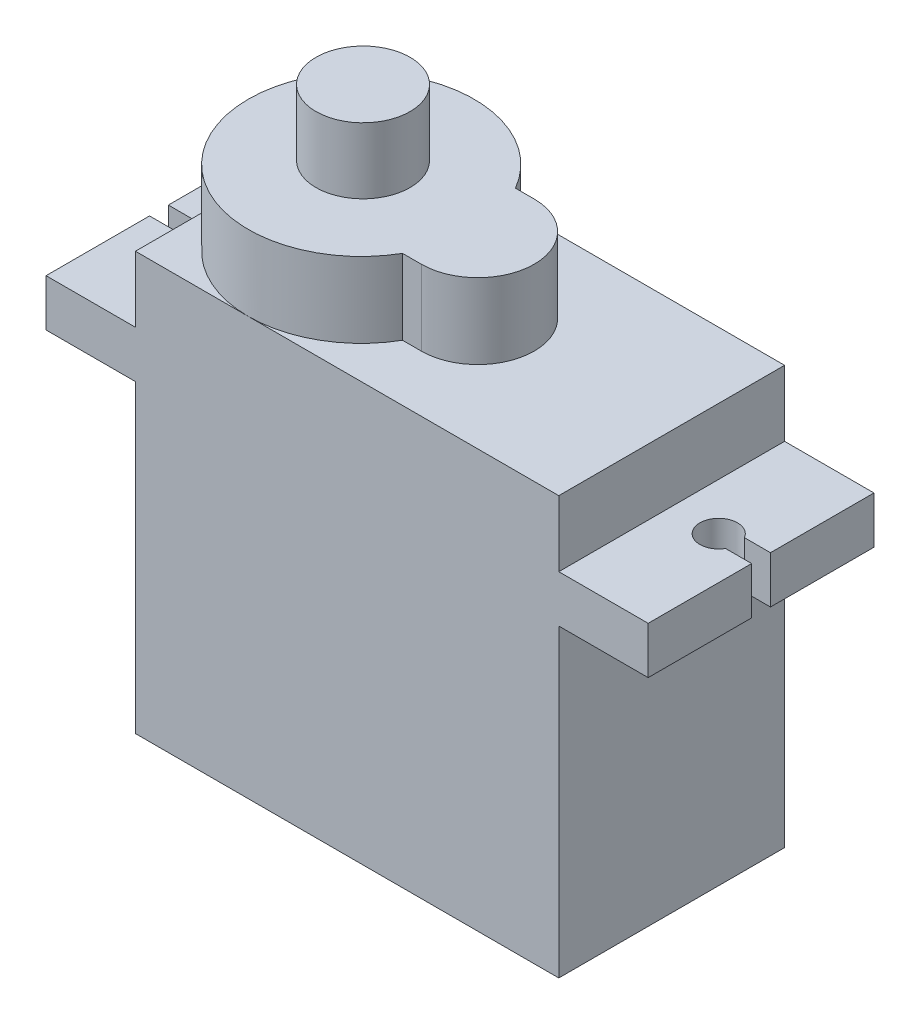
ISO-10303-21;
HEADER;
FILE_DESCRIPTION(('STEP AP214'),'2;1');
FILE_NAME('part.step','',(''),(''),'','','');
FILE_SCHEMA(('AUTOMOTIVE_DESIGN { 1 0 10303 214 1 1 1 1 }'));
ENDSEC;
DATA;
#1=APPLICATION_CONTEXT('core data for automotive mechanical design processes');
#2=APPLICATION_PROTOCOL_DEFINITION('international standard','automotive_design',2000,#1);
#3=PRODUCT_CONTEXT('',#1,'mechanical');
#4=PRODUCT('Part','Part','',(#3));
#5=PRODUCT_RELATED_PRODUCT_CATEGORY('part','',(#4));
#6=PRODUCT_DEFINITION_FORMATION('','',#4);
#7=PRODUCT_DEFINITION_CONTEXT('part definition',#1,'design');
#8=PRODUCT_DEFINITION('design','',#6,#7);
#9=PRODUCT_DEFINITION_SHAPE('','',#8);
#10=(LENGTH_UNIT() NAMED_UNIT(*) SI_UNIT(.MILLI.,.METRE.));
#11=(NAMED_UNIT(*) PLANE_ANGLE_UNIT() SI_UNIT($,.RADIAN.));
#12=(NAMED_UNIT(*) SI_UNIT($,.STERADIAN.) SOLID_ANGLE_UNIT());
#13=UNCERTAINTY_MEASURE_WITH_UNIT(LENGTH_MEASURE(1.E-05),#10,'distance_accuracy_value','');
#14=(GEOMETRIC_REPRESENTATION_CONTEXT(3) GLOBAL_UNCERTAINTY_ASSIGNED_CONTEXT((#13)) GLOBAL_UNIT_ASSIGNED_CONTEXT((#10,
#11,#12)) REPRESENTATION_CONTEXT('',''));
#15=CARTESIAN_POINT('',(0.,0.,0.));
#16=DIRECTION('',(0.,0.,1.));
#17=DIRECTION('',(1.,0.,0.));
#18=AXIS2_PLACEMENT_3D('',#15,#16,#17);
#19=CARTESIAN_POINT('',(-16.,0.,0.));
#20=DIRECTION('',(-1.,0.,0.));
#21=DIRECTION('',(0.,0.,1.));
#22=AXIS2_PLACEMENT_3D('',#19,#20,#21);
#23=PLANE('',#22);
#24=DIRECTION('',(0.,0.,-1.));
#25=VECTOR('',#24,1.);
#26=CARTESIAN_POINT('',(-16.,16.2,6.));
#27=LINE('',#26,#25);
#28=CARTESIAN_POINT('',(-16.,16.2,-0.5));
#29=VERTEX_POINT('',#28);
#30=CARTESIAN_POINT('',(-16.,16.2,-6.));
#31=VERTEX_POINT('',#30);
#32=EDGE_CURVE('E278',#29,#31,#27,.T.);
#33=ORIENTED_EDGE('',*,*,#32,.F.);
#34=DIRECTION('',(0.,1.,0.));
#35=VECTOR('',#34,1.);
#36=CARTESIAN_POINT('',(-16.,12.3839156193816,-0.5));
#37=LINE('',#36,#35);
#38=CARTESIAN_POINT('',(-16.,18.7,-0.5));
#39=VERTEX_POINT('',#38);
#40=EDGE_CURVE('E216',#29,#39,#37,.T.);
#41=ORIENTED_EDGE('',*,*,#40,.T.);
#42=DIRECTION('',(0.,0.,1.));
#43=VECTOR('',#42,1.);
#44=CARTESIAN_POINT('',(-16.,18.7,6.));
#45=LINE('',#44,#43);
#46=CARTESIAN_POINT('',(-16.,18.7,-6.));
#47=VERTEX_POINT('',#46);
#48=EDGE_CURVE('E227',#47,#39,#45,.T.);
#49=ORIENTED_EDGE('',*,*,#48,.F.);
#50=DIRECTION('',(0.,1.,0.));
#51=VECTOR('',#50,1.);
#52=CARTESIAN_POINT('',(-16.,18.7,-6.));
#53=LINE('',#52,#51);
#54=EDGE_CURVE('E282',#31,#47,#53,.T.);
#55=ORIENTED_EDGE('',*,*,#54,.F.);
#56=EDGE_LOOP('',(#33,#41,#49,#55));
#57=FACE_BOUND('',#56,.T.);
#58=ADVANCED_FACE('F33',(#57),#23,.T.);
#59=CARTESIAN_POINT('',(-16.,18.7,0.5));
#60=VERTEX_POINT('',#59);
#61=CARTESIAN_POINT('',(-16.,18.7,6.));
#62=VERTEX_POINT('',#61);
#63=EDGE_CURVE('E260',#60,#62,#45,.T.);
#64=ORIENTED_EDGE('',*,*,#63,.F.);
#65=DIRECTION('',(0.,1.,0.));
#66=VECTOR('',#65,1.);
#67=CARTESIAN_POINT('',(-16.,12.3839156193816,0.5));
#68=LINE('',#67,#66);
#69=CARTESIAN_POINT('',(-16.,16.2,0.5));
#70=VERTEX_POINT('',#69);
#71=EDGE_CURVE('E233',#70,#60,#68,.T.);
#72=ORIENTED_EDGE('',*,*,#71,.F.);
#73=CARTESIAN_POINT('',(-16.,16.2,6.));
#74=VERTEX_POINT('',#73);
#75=EDGE_CURVE('E279',#74,#70,#27,.T.);
#76=ORIENTED_EDGE('',*,*,#75,.F.);
#77=DIRECTION('',(0.,-1.,0.));
#78=VECTOR('',#77,1.);
#79=CARTESIAN_POINT('',(-16.,18.7,6.));
#80=LINE('',#79,#78);
#81=EDGE_CURVE('E275',#62,#74,#80,.T.);
#82=ORIENTED_EDGE('',*,*,#81,.F.);
#83=EDGE_LOOP('',(#64,#72,#76,#82));
#84=FACE_BOUND('',#83,.T.);
#85=ADVANCED_FACE('F445',(#84),#23,.T.);
#86=CARTESIAN_POINT('',(16.,0.,0.));
#87=DIRECTION('',(-1.,0.,0.));
#88=DIRECTION('',(0.,0.,1.));
#89=AXIS2_PLACEMENT_3D('',#86,#87,#88);
#90=PLANE('',#89);
#91=DIRECTION('',(0.,0.,1.));
#92=VECTOR('',#91,1.);
#93=CARTESIAN_POINT('',(16.,18.7,6.));
#94=LINE('',#93,#92);
#95=CARTESIAN_POINT('',(16.,18.7,-6.));
#96=VERTEX_POINT('',#95);
#97=CARTESIAN_POINT('',(16.,18.7,-0.5));
#98=VERTEX_POINT('',#97);
#99=EDGE_CURVE('E261',#96,#98,#94,.T.);
#100=ORIENTED_EDGE('',*,*,#99,.T.);
#101=DIRECTION('',(0.,1.,0.));
#102=VECTOR('',#101,1.);
#103=CARTESIAN_POINT('',(16.,12.3839156193816,-0.5));
#104=LINE('',#103,#102);
#105=CARTESIAN_POINT('',(16.,16.2,-0.5));
#106=VERTEX_POINT('',#105);
#107=EDGE_CURVE('E254',#106,#98,#104,.T.);
#108=ORIENTED_EDGE('',*,*,#107,.F.);
#109=DIRECTION('',(0.,0.,-1.));
#110=VECTOR('',#109,1.);
#111=CARTESIAN_POINT('',(16.,16.2,6.));
#112=LINE('',#111,#110);
#113=CARTESIAN_POINT('',(16.,16.2,-6.));
#114=VERTEX_POINT('',#113);
#115=EDGE_CURVE('E267',#106,#114,#112,.T.);
#116=ORIENTED_EDGE('',*,*,#115,.T.);
#117=DIRECTION('',(0.,1.,0.));
#118=VECTOR('',#117,1.);
#119=CARTESIAN_POINT('',(16.,18.7,-6.));
#120=LINE('',#119,#118);
#121=EDGE_CURVE('E271',#114,#96,#120,.T.);
#122=ORIENTED_EDGE('',*,*,#121,.T.);
#123=EDGE_LOOP('',(#100,#108,#116,#122));
#124=FACE_BOUND('',#123,.T.);
#125=ADVANCED_FACE('F451',(#124),#90,.F.);
#126=CARTESIAN_POINT('',(11.25,0.,6.));
#127=DIRECTION('',(-1.,0.,0.));
#128=DIRECTION('',(0.,-1.,0.));
#129=AXIS2_PLACEMENT_3D('',#126,#127,#128);
#130=PLANE('',#129);
#131=DIRECTION('',(0.,0.,1.));
#132=VECTOR('',#131,1.);
#133=CARTESIAN_POINT('',(11.25,18.7,6.));
#134=LINE('',#133,#132);
#135=CARTESIAN_POINT('',(11.25,18.7,-6.));
#136=VERTEX_POINT('',#135);
#137=CARTESIAN_POINT('',(11.25,18.7,6.));
#138=VERTEX_POINT('',#137);
#139=EDGE_CURVE('E309',#136,#138,#134,.T.);
#140=ORIENTED_EDGE('',*,*,#139,.F.);
#141=DIRECTION('',(0.,1.,0.));
#142=VECTOR('',#141,1.);
#143=CARTESIAN_POINT('',(11.25,0.,-6.));
#144=LINE('',#143,#142);
#145=CARTESIAN_POINT('',(11.25,22.2,-6.));
#146=VERTEX_POINT('',#145);
#147=EDGE_CURVE('E350',#136,#146,#144,.T.);
#148=ORIENTED_EDGE('',*,*,#147,.T.);
#149=DIRECTION('',(0.,0.,-1.));
#150=VECTOR('',#149,1.);
#151=CARTESIAN_POINT('',(11.25,22.2,6.));
#152=LINE('',#151,#150);
#153=CARTESIAN_POINT('',(11.25,22.2,6.));
#154=VERTEX_POINT('',#153);
#155=EDGE_CURVE('E37',#154,#146,#152,.T.);
#156=ORIENTED_EDGE('',*,*,#155,.F.);
#157=DIRECTION('',(0.,1.,0.));
#158=VECTOR('',#157,1.);
#159=CARTESIAN_POINT('',(11.25,0.,6.));
#160=LINE('',#159,#158);
#161=EDGE_CURVE('E355',#138,#154,#160,.T.);
#162=ORIENTED_EDGE('',*,*,#161,.F.);
#163=EDGE_LOOP('',(#140,#148,#156,#162));
#164=FACE_BOUND('',#163,.T.);
#165=ADVANCED_FACE('F35',(#164),#130,.F.);
#166=DIRECTION('',(0.,0.,-1.));
#167=VECTOR('',#166,1.);
#168=CARTESIAN_POINT('',(11.25,16.2,6.));
#169=LINE('',#168,#167);
#170=CARTESIAN_POINT('',(11.25,16.2,6.));
#171=VERTEX_POINT('',#170);
#172=CARTESIAN_POINT('',(11.25,16.2,-6.));
#173=VERTEX_POINT('',#172);
#174=EDGE_CURVE('E303',#171,#173,#169,.T.);
#175=ORIENTED_EDGE('',*,*,#174,.F.);
#176=CARTESIAN_POINT('',(11.25,0.,6.));
#177=VERTEX_POINT('',#176);
#178=EDGE_CURVE('E351',#177,#171,#160,.T.);
#179=ORIENTED_EDGE('',*,*,#178,.F.);
#180=DIRECTION('',(0.,0.,-1.));
#181=VECTOR('',#180,1.);
#182=CARTESIAN_POINT('',(11.25,0.,6.));
#183=LINE('',#182,#181);
#184=CARTESIAN_POINT('',(11.25,0.,-6.));
#185=VERTEX_POINT('',#184);
#186=EDGE_CURVE('E365',#177,#185,#183,.T.);
#187=ORIENTED_EDGE('',*,*,#186,.T.);
#188=EDGE_CURVE('E366',#185,#173,#144,.T.);
#189=ORIENTED_EDGE('',*,*,#188,.T.);
#190=EDGE_LOOP('',(#175,#179,#187,#189));
#191=FACE_BOUND('',#190,.T.);
#192=ADVANCED_FACE('F498',(#191),#130,.F.);
#193=CARTESIAN_POINT('',(-11.25,0.,6.));
#194=DIRECTION('',(1.,0.,0.));
#195=DIRECTION('',(0.,1.,0.));
#196=AXIS2_PLACEMENT_3D('',#193,#194,#195);
#197=PLANE('',#196);
#198=DIRECTION('',(0.,0.,-1.));
#199=VECTOR('',#198,1.);
#200=CARTESIAN_POINT('',(-11.25,18.7,6.));
#201=LINE('',#200,#199);
#202=CARTESIAN_POINT('',(-11.25,18.7,6.));
#203=VERTEX_POINT('',#202);
#204=CARTESIAN_POINT('',(-11.25,18.7,-6.));
#205=VERTEX_POINT('',#204);
#206=EDGE_CURVE('E306',#203,#205,#201,.T.);
#207=ORIENTED_EDGE('',*,*,#206,.F.);
#208=DIRECTION('',(0.,-1.,0.));
#209=VECTOR('',#208,1.);
#210=CARTESIAN_POINT('',(-11.25,0.,6.));
#211=LINE('',#210,#209);
#212=CARTESIAN_POINT('',(-11.25,22.2,6.));
#213=VERTEX_POINT('',#212);
#214=EDGE_CURVE('E360',#213,#203,#211,.T.);
#215=ORIENTED_EDGE('',*,*,#214,.F.);
#216=DIRECTION('',(0.,0.,-1.));
#217=VECTOR('',#216,1.);
#218=CARTESIAN_POINT('',(-11.25,22.2,6.));
#219=LINE('',#218,#217);
#220=CARTESIAN_POINT('',(-11.25,22.2,0.));
#221=VERTEX_POINT('',#220);
#222=EDGE_CURVE('E382',#213,#221,#219,.T.);
#223=ORIENTED_EDGE('',*,*,#222,.T.);
#224=CARTESIAN_POINT('',(-11.25,22.2,-6.));
#225=VERTEX_POINT('',#224);
#226=EDGE_CURVE('E381',#221,#225,#219,.T.);
#227=ORIENTED_EDGE('',*,*,#226,.T.);
#228=DIRECTION('',(0.,-1.,0.));
#229=VECTOR('',#228,1.);
#230=CARTESIAN_POINT('',(-11.25,0.,-6.));
#231=LINE('',#230,#229);
#232=EDGE_CURVE('E373',#225,#205,#231,.T.);
#233=ORIENTED_EDGE('',*,*,#232,.T.);
#234=EDGE_LOOP('',(#207,#215,#223,#227,#233));
#235=FACE_BOUND('',#234,.T.);
#236=ADVANCED_FACE('F391',(#235),#197,.F.);
#237=DIRECTION('',(0.,0.,1.));
#238=VECTOR('',#237,1.);
#239=CARTESIAN_POINT('',(-11.25,16.2,6.));
#240=LINE('',#239,#238);
#241=CARTESIAN_POINT('',(-11.25,16.2,-6.));
#242=VERTEX_POINT('',#241);
#243=CARTESIAN_POINT('',(-11.25,16.2,6.));
#244=VERTEX_POINT('',#243);
#245=EDGE_CURVE('E300',#242,#244,#240,.T.);
#246=ORIENTED_EDGE('',*,*,#245,.F.);
#247=CARTESIAN_POINT('',(-11.25,0.,-6.));
#248=VERTEX_POINT('',#247);
#249=EDGE_CURVE('E372',#242,#248,#231,.T.);
#250=ORIENTED_EDGE('',*,*,#249,.T.);
#251=DIRECTION('',(0.,0.,-1.));
#252=VECTOR('',#251,1.);
#253=CARTESIAN_POINT('',(-11.25,0.,6.));
#254=LINE('',#253,#252);
#255=CARTESIAN_POINT('',(-11.25,0.,6.));
#256=VERTEX_POINT('',#255);
#257=EDGE_CURVE('E379',#256,#248,#254,.T.);
#258=ORIENTED_EDGE('',*,*,#257,.F.);
#259=EDGE_CURVE('E359',#244,#256,#211,.T.);
#260=ORIENTED_EDGE('',*,*,#259,.F.);
#261=EDGE_LOOP('',(#246,#250,#258,#260));
#262=FACE_BOUND('',#261,.T.);
#263=ADVANCED_FACE('F491',(#262),#197,.F.);
#264=CARTESIAN_POINT('',(11.25,22.2,6.));
#265=DIRECTION('',(0.,-1.,0.));
#266=DIRECTION('',(0.,0.,-1.));
#267=AXIS2_PLACEMENT_3D('',#264,#265,#266);
#268=PLANE('',#267);
#269=CARTESIAN_POINT('',(-5.25,22.2,0.));
#270=DIRECTION('',(0.,1.,0.));
#271=DIRECTION('',(0.,0.,1.));
#272=AXIS2_PLACEMENT_3D('',#269,#270,#271);
#273=CIRCLE('',#272,6.);
#274=CARTESIAN_POINT('',(-5.25,22.2,6.));
#275=VERTEX_POINT('',#274);
#276=EDGE_CURVE('E11',#221,#275,#273,.T.);
#277=ORIENTED_EDGE('',*,*,#276,.F.);
#278=ORIENTED_EDGE('',*,*,#222,.F.);
#279=DIRECTION('',(-1.,0.,0.));
#280=VECTOR('',#279,1.);
#281=CARTESIAN_POINT('',(11.25,22.2,6.));
#282=LINE('',#281,#280);
#283=EDGE_CURVE('E354',#275,#213,#282,.T.);
#284=ORIENTED_EDGE('',*,*,#283,.F.);
#285=EDGE_LOOP('',(#277,#278,#284));
#286=FACE_BOUND('',#285,.T.);
#287=ADVANCED_FACE('F410',(#286),#268,.F.);
#288=CARTESIAN_POINT('',(-0.0538475772933659,22.2,3.));
#289=VERTEX_POINT('',#288);
#290=EDGE_CURVE('E42',#275,#289,#273,.T.);
#291=ORIENTED_EDGE('',*,*,#290,.F.);
#292=EDGE_CURVE('E356',#154,#275,#282,.T.);
#293=ORIENTED_EDGE('',*,*,#292,.F.);
#294=ORIENTED_EDGE('',*,*,#155,.T.);
#295=DIRECTION('',(-1.,0.,0.));
#296=VECTOR('',#295,1.);
#297=CARTESIAN_POINT('',(11.25,22.2,-6.));
#298=LINE('',#297,#296);
#299=CARTESIAN_POINT('',(-5.25,22.2,-6.));
#300=VERTEX_POINT('',#299);
#301=EDGE_CURVE('E369',#146,#300,#298,.T.);
#302=ORIENTED_EDGE('',*,*,#301,.T.);
#303=CARTESIAN_POINT('',(-0.0538475772933677,22.2,-3.));
#304=VERTEX_POINT('',#303);
#305=EDGE_CURVE('E44',#304,#300,#273,.T.);
#306=ORIENTED_EDGE('',*,*,#305,.F.);
#307=DIRECTION('',(-1.,0.,0.));
#308=VECTOR('',#307,1.);
#309=CARTESIAN_POINT('',(0.946152422706632,22.2,-3.));
#310=LINE('',#309,#308);
#311=CARTESIAN_POINT('',(0.946152422706632,22.2,-3.));
#312=VERTEX_POINT('',#311);
#313=EDGE_CURVE('E332',#312,#304,#310,.T.);
#314=ORIENTED_EDGE('',*,*,#313,.F.);
#315=CARTESIAN_POINT('',(0.946152422706634,22.2,0.));
#316=DIRECTION('',(0.,1.,0.));
#317=DIRECTION('',(0.,0.,1.));
#318=AXIS2_PLACEMENT_3D('',#315,#316,#317);
#319=CIRCLE('',#318,3.);
#320=CARTESIAN_POINT('',(0.946152422706634,22.2,3.));
#321=VERTEX_POINT('',#320);
#322=EDGE_CURVE('E316',#321,#312,#319,.T.);
#323=ORIENTED_EDGE('',*,*,#322,.F.);
#324=DIRECTION('',(1.,0.,0.));
#325=VECTOR('',#324,1.);
#326=CARTESIAN_POINT('',(0.946152422706634,22.2,3.));
#327=LINE('',#326,#325);
#328=EDGE_CURVE('E323',#289,#321,#327,.T.);
#329=ORIENTED_EDGE('',*,*,#328,.F.);
#330=EDGE_LOOP('',(#291,#293,#294,#302,#306,#314,#323,#329));
#331=FACE_BOUND('',#330,.T.);
#332=ADVANCED_FACE('F418',(#331),#268,.F.);
#333=EDGE_CURVE('E336',#300,#221,#273,.T.);
#334=ORIENTED_EDGE('',*,*,#333,.F.);
#335=EDGE_CURVE('E368',#300,#225,#298,.T.);
#336=ORIENTED_EDGE('',*,*,#335,.T.);
#337=ORIENTED_EDGE('',*,*,#226,.F.);
#338=EDGE_LOOP('',(#334,#336,#337));
#339=FACE_BOUND('',#338,.T.);
#340=ADVANCED_FACE('F395',(#339),#268,.F.);
#341=CARTESIAN_POINT('',(11.25,0.,6.));
#342=DIRECTION('',(0.,1.,0.));
#343=DIRECTION('',(0.,0.,1.));
#344=AXIS2_PLACEMENT_3D('',#341,#342,#343);
#345=PLANE('',#344);
#346=DIRECTION('',(1.,0.,0.));
#347=VECTOR('',#346,1.);
#348=CARTESIAN_POINT('',(11.25,0.,-6.));
#349=LINE('',#348,#347);
#350=EDGE_CURVE('E375',#248,#185,#349,.T.);
#351=ORIENTED_EDGE('',*,*,#350,.T.);
#352=ORIENTED_EDGE('',*,*,#186,.F.);
#353=DIRECTION('',(1.,0.,0.));
#354=VECTOR('',#353,1.);
#355=CARTESIAN_POINT('',(11.25,0.,6.));
#356=LINE('',#355,#354);
#357=EDGE_CURVE('E363',#256,#177,#356,.T.);
#358=ORIENTED_EDGE('',*,*,#357,.F.);
#359=ORIENTED_EDGE('',*,*,#257,.T.);
#360=EDGE_LOOP('',(#351,#352,#358,#359));
#361=FACE_BOUND('',#360,.T.);
#362=ADVANCED_FACE('F494',(#361),#345,.F.);
#363=CARTESIAN_POINT('',(0.,0.,6.));
#364=DIRECTION('',(0.,0.,1.));
#365=DIRECTION('',(1.,0.,0.));
#366=AXIS2_PLACEMENT_3D('',#363,#364,#365);
#367=PLANE('',#366);
#368=ORIENTED_EDGE('',*,*,#178,.T.);
#369=DIRECTION('',(-1.,0.,0.));
#370=VECTOR('',#369,1.);
#371=CARTESIAN_POINT('',(16.,16.2,6.));
#372=LINE('',#371,#370);
#373=CARTESIAN_POINT('',(16.,16.2,6.));
#374=VERTEX_POINT('',#373);
#375=EDGE_CURVE('E293',#374,#171,#372,.T.);
#376=ORIENTED_EDGE('',*,*,#375,.F.);
#377=DIRECTION('',(0.,-1.,0.));
#378=VECTOR('',#377,1.);
#379=CARTESIAN_POINT('',(16.,18.7,6.));
#380=LINE('',#379,#378);
#381=CARTESIAN_POINT('',(16.,18.7,6.));
#382=VERTEX_POINT('',#381);
#383=EDGE_CURVE('E264',#382,#374,#380,.T.);
#384=ORIENTED_EDGE('',*,*,#383,.F.);
#385=DIRECTION('',(-1.,0.,0.));
#386=VECTOR('',#385,1.);
#387=CARTESIAN_POINT('',(16.,18.7,6.));
#388=LINE('',#387,#386);
#389=EDGE_CURVE('E297',#382,#138,#388,.T.);
#390=ORIENTED_EDGE('',*,*,#389,.T.);
#391=ORIENTED_EDGE('',*,*,#161,.T.);
#392=ORIENTED_EDGE('',*,*,#292,.T.);
#393=ORIENTED_EDGE('',*,*,#283,.T.);
#394=ORIENTED_EDGE('',*,*,#214,.T.);
#395=EDGE_CURVE('E296',#203,#62,#388,.T.);
#396=ORIENTED_EDGE('',*,*,#395,.T.);
#397=ORIENTED_EDGE('',*,*,#81,.T.);
#398=EDGE_CURVE('E292',#244,#74,#372,.T.);
#399=ORIENTED_EDGE('',*,*,#398,.F.);
#400=ORIENTED_EDGE('',*,*,#259,.T.);
#401=ORIENTED_EDGE('',*,*,#357,.T.);
#402=EDGE_LOOP('',(#368,#376,#384,#390,#391,#392,#393,#394,#396,#397,#399,#400,#401));
#403=FACE_BOUND('',#402,.T.);
#404=ADVANCED_FACE('F405',(#403),#367,.T.);
#405=CARTESIAN_POINT('',(0.,0.,-6.));
#406=DIRECTION('',(0.,0.,1.));
#407=DIRECTION('',(1.,0.,0.));
#408=AXIS2_PLACEMENT_3D('',#405,#406,#407);
#409=PLANE('',#408);
#410=ORIENTED_EDGE('',*,*,#249,.F.);
#411=DIRECTION('',(-1.,0.,0.));
#412=VECTOR('',#411,1.);
#413=CARTESIAN_POINT('',(16.,16.2,-6.));
#414=LINE('',#413,#412);
#415=EDGE_CURVE('E288',#242,#31,#414,.T.);
#416=ORIENTED_EDGE('',*,*,#415,.T.);
#417=ORIENTED_EDGE('',*,*,#54,.T.);
#418=DIRECTION('',(-1.,0.,0.));
#419=VECTOR('',#418,1.);
#420=CARTESIAN_POINT('',(16.,18.7,-6.));
#421=LINE('',#420,#419);
#422=EDGE_CURVE('E273',#205,#47,#421,.T.);
#423=ORIENTED_EDGE('',*,*,#422,.F.);
#424=ORIENTED_EDGE('',*,*,#232,.F.);
#425=ORIENTED_EDGE('',*,*,#335,.F.);
#426=ORIENTED_EDGE('',*,*,#301,.F.);
#427=ORIENTED_EDGE('',*,*,#147,.F.);
#428=EDGE_CURVE('E285',#96,#136,#421,.T.);
#429=ORIENTED_EDGE('',*,*,#428,.F.);
#430=ORIENTED_EDGE('',*,*,#121,.F.);
#431=EDGE_CURVE('E289',#114,#173,#414,.T.);
#432=ORIENTED_EDGE('',*,*,#431,.T.);
#433=ORIENTED_EDGE('',*,*,#188,.F.);
#434=ORIENTED_EDGE('',*,*,#350,.F.);
#435=EDGE_LOOP('',(#410,#416,#417,#423,#424,#425,#426,#427,#429,#430,#432,#433,#434));
#436=FACE_BOUND('',#435,.T.);
#437=ADVANCED_FACE('F399',(#436),#409,.F.);
#438=CARTESIAN_POINT('',(0.946152422706634,26.2,0.));
#439=DIRECTION('',(0.,-1.,0.));
#440=DIRECTION('',(0.,0.,-1.));
#441=AXIS2_PLACEMENT_3D('',#438,#439,#440);
#442=CYLINDRICAL_SURFACE('',#441,3.);
#443=ORIENTED_EDGE('',*,*,#322,.T.);
#444=DIRECTION('',(0.,-1.,0.));
#445=VECTOR('',#444,1.);
#446=CARTESIAN_POINT('',(0.946152422706632,26.2,-3.));
#447=LINE('',#446,#445);
#448=CARTESIAN_POINT('',(0.946152422706632,26.2,-3.));
#449=VERTEX_POINT('',#448);
#450=EDGE_CURVE('E347',#449,#312,#447,.T.);
#451=ORIENTED_EDGE('',*,*,#450,.F.);
#452=CARTESIAN_POINT('',(0.946152422706634,26.2,0.));
#453=DIRECTION('',(0.,1.,0.));
#454=DIRECTION('',(0.,0.,1.));
#455=AXIS2_PLACEMENT_3D('',#452,#453,#454);
#456=CIRCLE('',#455,3.);
#457=CARTESIAN_POINT('',(0.946152422706634,26.2,3.));
#458=VERTEX_POINT('',#457);
#459=EDGE_CURVE('E319',#458,#449,#456,.T.);
#460=ORIENTED_EDGE('',*,*,#459,.F.);
#461=DIRECTION('',(0.,-1.,0.));
#462=VECTOR('',#461,1.);
#463=CARTESIAN_POINT('',(0.946152422706634,26.2,3.));
#464=LINE('',#463,#462);
#465=EDGE_CURVE('E329',#458,#321,#464,.T.);
#466=ORIENTED_EDGE('',*,*,#465,.T.);
#467=EDGE_LOOP('',(#443,#451,#460,#466));
#468=FACE_BOUND('',#467,.T.);
#469=ADVANCED_FACE('F424',(#468),#442,.T.);
#470=CARTESIAN_POINT('',(0.946152422706632,26.2,-3.));
#471=DIRECTION('',(0.,0.,1.));
#472=DIRECTION('',(1.,0.,0.));
#473=AXIS2_PLACEMENT_3D('',#470,#471,#472);
#474=PLANE('',#473);
#475=ORIENTED_EDGE('',*,*,#313,.T.);
#476=DIRECTION('',(0.,-1.,0.));
#477=VECTOR('',#476,1.);
#478=CARTESIAN_POINT('',(-0.0538475772933677,26.2,-3.));
#479=LINE('',#478,#477);
#480=CARTESIAN_POINT('',(-0.0538475772933677,26.2,-3.));
#481=VERTEX_POINT('',#480);
#482=EDGE_CURVE('E344',#481,#304,#479,.T.);
#483=ORIENTED_EDGE('',*,*,#482,.F.);
#484=DIRECTION('',(-1.,0.,0.));
#485=VECTOR('',#484,1.);
#486=CARTESIAN_POINT('',(0.946152422706632,26.2,-3.));
#487=LINE('',#486,#485);
#488=EDGE_CURVE('E322',#449,#481,#487,.T.);
#489=ORIENTED_EDGE('',*,*,#488,.F.);
#490=ORIENTED_EDGE('',*,*,#450,.T.);
#491=EDGE_LOOP('',(#475,#483,#489,#490));
#492=FACE_BOUND('',#491,.T.);
#493=ADVANCED_FACE('F420',(#492),#474,.F.);
#494=CARTESIAN_POINT('',(-5.25,26.2,0.));
#495=DIRECTION('',(0.,-1.,0.));
#496=DIRECTION('',(0.,0.,-1.));
#497=AXIS2_PLACEMENT_3D('',#494,#495,#496);
#498=CYLINDRICAL_SURFACE('',#497,6.);
#499=ORIENTED_EDGE('',*,*,#305,.T.);
#500=ORIENTED_EDGE('',*,*,#333,.T.);
#501=ORIENTED_EDGE('',*,*,#276,.T.);
#502=ORIENTED_EDGE('',*,*,#290,.T.);
#503=DIRECTION('',(0.,-1.,0.));
#504=VECTOR('',#503,1.);
#505=CARTESIAN_POINT('',(-0.0538475772933659,26.2,3.));
#506=LINE('',#505,#504);
#507=CARTESIAN_POINT('',(-0.0538475772933659,26.2,3.));
#508=VERTEX_POINT('',#507);
#509=EDGE_CURVE('E341',#508,#289,#506,.T.);
#510=ORIENTED_EDGE('',*,*,#509,.F.);
#511=CARTESIAN_POINT('',(-5.25,26.2,0.));
#512=DIRECTION('',(0.,1.,0.));
#513=DIRECTION('',(0.,0.,1.));
#514=AXIS2_PLACEMENT_3D('',#511,#512,#513);
#515=CIRCLE('',#514,6.);
#516=EDGE_CURVE('E325',#481,#508,#515,.T.);
#517=ORIENTED_EDGE('',*,*,#516,.F.);
#518=ORIENTED_EDGE('',*,*,#482,.T.);
#519=EDGE_LOOP('',(#499,#500,#501,#502,#510,#517,#518));
#520=FACE_BOUND('',#519,.T.);
#521=ADVANCED_FACE('F413',(#520),#498,.T.);
#522=CARTESIAN_POINT('',(0.946152422706634,26.2,3.));
#523=DIRECTION('',(0.,0.,-1.));
#524=DIRECTION('',(-1.,0.,0.));
#525=AXIS2_PLACEMENT_3D('',#522,#523,#524);
#526=PLANE('',#525);
#527=ORIENTED_EDGE('',*,*,#328,.T.);
#528=ORIENTED_EDGE('',*,*,#465,.F.);
#529=DIRECTION('',(1.,0.,0.));
#530=VECTOR('',#529,1.);
#531=CARTESIAN_POINT('',(0.946152422706634,26.2,3.));
#532=LINE('',#531,#530);
#533=EDGE_CURVE('E327',#508,#458,#532,.T.);
#534=ORIENTED_EDGE('',*,*,#533,.F.);
#535=ORIENTED_EDGE('',*,*,#509,.T.);
#536=EDGE_LOOP('',(#527,#528,#534,#535));
#537=FACE_BOUND('',#536,.T.);
#538=ADVANCED_FACE('F427',(#537),#526,.F.);
#539=CARTESIAN_POINT('',(0.946152422706634,26.2,0.));
#540=DIRECTION('',(0.,1.,0.));
#541=DIRECTION('',(0.,0.,1.));
#542=AXIS2_PLACEMENT_3D('',#539,#540,#541);
#543=PLANE('',#542);
#544=CARTESIAN_POINT('',(-5.3794765265458,26.2,-0.226239140602047));
#545=DIRECTION('',(0.,1.,0.));
#546=DIRECTION('',(0.,0.,1.));
#547=AXIS2_PLACEMENT_3D('',#544,#545,#546);
#548=CIRCLE('',#547,2.5);
#549=CARTESIAN_POINT('',(-5.3794765265458,26.2,2.27376085939795));
#550=VERTEX_POINT('',#549);
#551=EDGE_CURVE('E312',#550,#550,#548,.T.);
#552=ORIENTED_EDGE('',*,*,#551,.F.);
#553=EDGE_LOOP('',(#552));
#554=FACE_BOUND('',#553,.T.);
#555=ORIENTED_EDGE('',*,*,#459,.T.);
#556=ORIENTED_EDGE('',*,*,#488,.T.);
#557=ORIENTED_EDGE('',*,*,#516,.T.);
#558=ORIENTED_EDGE('',*,*,#533,.T.);
#559=EDGE_LOOP('',(#555,#556,#557,#558));
#560=FACE_BOUND('',#559,.T.);
#561=ADVANCED_FACE('F430',(#554,#560),#543,.T.);
#562=CARTESIAN_POINT('',(-5.3794765265458,29.7,-0.226239140602047));
#563=DIRECTION('',(0.,-1.,0.));
#564=DIRECTION('',(0.,0.,-1.));
#565=AXIS2_PLACEMENT_3D('',#562,#563,#564);
#566=CYLINDRICAL_SURFACE('',#565,2.5);
#567=CARTESIAN_POINT('',(-5.3794765265458,29.7,-0.226239140602047));
#568=DIRECTION('',(0.,1.,0.));
#569=DIRECTION('',(0.,0.,1.));
#570=AXIS2_PLACEMENT_3D('',#567,#568,#569);
#571=CIRCLE('',#570,2.5);
#572=CARTESIAN_POINT('',(-5.3794765265458,29.7,2.27376085939795));
#573=VERTEX_POINT('',#572);
#574=EDGE_CURVE('E313',#573,#573,#571,.T.);
#575=ORIENTED_EDGE('',*,*,#574,.F.);
#576=EDGE_LOOP('',(#575));
#577=FACE_BOUND('',#576,.T.);
#578=ORIENTED_EDGE('',*,*,#551,.T.);
#579=EDGE_LOOP('',(#578));
#580=FACE_BOUND('',#579,.T.);
#581=ADVANCED_FACE('F432',(#577,#580),#566,.T.);
#582=CARTESIAN_POINT('',(-5.3794765265458,29.7,-0.226239140602047));
#583=DIRECTION('',(0.,1.,0.));
#584=DIRECTION('',(0.,0.,1.));
#585=AXIS2_PLACEMENT_3D('',#582,#583,#584);
#586=PLANE('',#585);
#587=ORIENTED_EDGE('',*,*,#574,.T.);
#588=EDGE_LOOP('',(#587));
#589=FACE_BOUND('',#588,.T.);
#590=ADVANCED_FACE('F439',(#589),#586,.T.);
#591=CARTESIAN_POINT('',(16.,16.2,6.));
#592=DIRECTION('',(0.,1.,0.));
#593=DIRECTION('',(0.,0.,1.));
#594=AXIS2_PLACEMENT_3D('',#591,#592,#593);
#595=PLANE('',#594);
#596=DIRECTION('',(-1.,0.,0.));
#597=VECTOR('',#596,1.);
#598=CARTESIAN_POINT('',(-14.6160254037844,16.2,-0.5));
#599=LINE('',#598,#597);
#600=CARTESIAN_POINT('',(-14.6160254037844,16.2,-0.5));
#601=VERTEX_POINT('',#600);
#602=EDGE_CURVE('E213',#601,#29,#599,.T.);
#603=ORIENTED_EDGE('',*,*,#602,.T.);
#604=ORIENTED_EDGE('',*,*,#32,.T.);
#605=ORIENTED_EDGE('',*,*,#415,.F.);
#606=ORIENTED_EDGE('',*,*,#245,.T.);
#607=ORIENTED_EDGE('',*,*,#398,.T.);
#608=ORIENTED_EDGE('',*,*,#75,.T.);
#609=DIRECTION('',(1.,0.,0.));
#610=VECTOR('',#609,1.);
#611=CARTESIAN_POINT('',(-14.6160254037844,16.2,0.5));
#612=LINE('',#611,#610);
#613=CARTESIAN_POINT('',(-14.6160254037844,16.2,0.5));
#614=VERTEX_POINT('',#613);
#615=EDGE_CURVE('E237',#70,#614,#612,.T.);
#616=ORIENTED_EDGE('',*,*,#615,.T.);
#617=CARTESIAN_POINT('',(-13.75,16.2,0.));
#618=DIRECTION('',(0.,1.,0.));
#619=DIRECTION('',(0.,0.,1.));
#620=AXIS2_PLACEMENT_3D('',#617,#618,#619);
#621=CIRCLE('',#620,1.);
#622=EDGE_CURVE('E247',#614,#601,#621,.T.);
#623=ORIENTED_EDGE('',*,*,#622,.T.);
#624=EDGE_LOOP('',(#603,#604,#605,#606,#607,#608,#616,#623));
#625=FACE_BOUND('',#624,.T.);
#626=ADVANCED_FACE('F463',(#625),#595,.F.);
#627=CARTESIAN_POINT('',(16.,18.7,6.));
#628=DIRECTION('',(0.,-1.,0.));
#629=DIRECTION('',(0.,0.,-1.));
#630=AXIS2_PLACEMENT_3D('',#627,#628,#629);
#631=PLANE('',#630);
#632=DIRECTION('',(1.,0.,0.));
#633=VECTOR('',#632,1.);
#634=CARTESIAN_POINT('',(-14.6160254037844,18.7,-0.5));
#635=LINE('',#634,#633);
#636=CARTESIAN_POINT('',(-14.6160254037844,18.7,-0.5));
#637=VERTEX_POINT('',#636);
#638=EDGE_CURVE('E210',#39,#637,#635,.T.);
#639=ORIENTED_EDGE('',*,*,#638,.T.);
#640=CARTESIAN_POINT('',(-13.75,18.7,0.));
#641=DIRECTION('',(0.,-1.,0.));
#642=DIRECTION('',(0.,0.,1.));
#643=AXIS2_PLACEMENT_3D('',#640,#641,#642);
#644=CIRCLE('',#643,1.);
#645=CARTESIAN_POINT('',(-14.6160254037844,18.7,0.5));
#646=VERTEX_POINT('',#645);
#647=EDGE_CURVE('E219',#637,#646,#644,.T.);
#648=ORIENTED_EDGE('',*,*,#647,.T.);
#649=DIRECTION('',(-1.,0.,0.));
#650=VECTOR('',#649,1.);
#651=CARTESIAN_POINT('',(-14.6160254037844,18.7,0.5));
#652=LINE('',#651,#650);
#653=EDGE_CURVE('E51',#646,#60,#652,.T.);
#654=ORIENTED_EDGE('',*,*,#653,.T.);
#655=ORIENTED_EDGE('',*,*,#63,.T.);
#656=ORIENTED_EDGE('',*,*,#395,.F.);
#657=ORIENTED_EDGE('',*,*,#206,.T.);
#658=ORIENTED_EDGE('',*,*,#422,.T.);
#659=ORIENTED_EDGE('',*,*,#48,.T.);
#660=EDGE_LOOP('',(#639,#648,#654,#655,#656,#657,#658,#659));
#661=FACE_BOUND('',#660,.T.);
#662=ADVANCED_FACE('F225',(#661),#631,.F.);
#663=CARTESIAN_POINT('',(13.75,18.7,0.));
#664=DIRECTION('',(0.,1.,0.));
#665=DIRECTION('',(0.,0.,1.));
#666=AXIS2_PLACEMENT_3D('',#663,#664,#665);
#667=CIRCLE('',#666,1.);
#668=CARTESIAN_POINT('',(14.6160254037844,18.7,-0.5));
#669=VERTEX_POINT('',#668);
#670=CARTESIAN_POINT('',(14.6160254037844,18.7,0.5));
#671=VERTEX_POINT('',#670);
#672=EDGE_CURVE('E244',#669,#671,#667,.T.);
#673=ORIENTED_EDGE('',*,*,#672,.F.);
#674=DIRECTION('',(-1.,0.,0.));
#675=VECTOR('',#674,1.);
#676=CARTESIAN_POINT('',(14.6160254037844,18.7,-0.5));
#677=LINE('',#676,#675);
#678=EDGE_CURVE('E249',#98,#669,#677,.T.);
#679=ORIENTED_EDGE('',*,*,#678,.F.);
#680=ORIENTED_EDGE('',*,*,#99,.F.);
#681=ORIENTED_EDGE('',*,*,#428,.T.);
#682=ORIENTED_EDGE('',*,*,#139,.T.);
#683=ORIENTED_EDGE('',*,*,#389,.F.);
#684=CARTESIAN_POINT('',(16.,18.7,0.5));
#685=VERTEX_POINT('',#684);
#686=EDGE_CURVE('E265',#685,#382,#94,.T.);
#687=ORIENTED_EDGE('',*,*,#686,.F.);
#688=DIRECTION('',(1.,0.,0.));
#689=VECTOR('',#688,1.);
#690=CARTESIAN_POINT('',(14.6160254037844,18.7,0.5));
#691=LINE('',#690,#689);
#692=EDGE_CURVE('E59',#671,#685,#691,.T.);
#693=ORIENTED_EDGE('',*,*,#692,.F.);
#694=EDGE_LOOP('',(#673,#679,#680,#681,#682,#683,#687,#693));
#695=FACE_BOUND('',#694,.T.);
#696=ADVANCED_FACE('F461',(#695),#631,.F.);
#697=ORIENTED_EDGE('',*,*,#115,.F.);
#698=DIRECTION('',(1.,0.,0.));
#699=VECTOR('',#698,1.);
#700=CARTESIAN_POINT('',(14.6160254037844,16.2,-0.5));
#701=LINE('',#700,#699);
#702=CARTESIAN_POINT('',(14.6160254037844,16.2,-0.5));
#703=VERTEX_POINT('',#702);
#704=EDGE_CURVE('E238',#703,#106,#701,.T.);
#705=ORIENTED_EDGE('',*,*,#704,.F.);
#706=CARTESIAN_POINT('',(13.75,16.2,0.));
#707=DIRECTION('',(0.,1.,0.));
#708=DIRECTION('',(0.,0.,1.));
#709=AXIS2_PLACEMENT_3D('',#706,#707,#708);
#710=CIRCLE('',#709,1.);
#711=CARTESIAN_POINT('',(14.6160254037844,16.2,0.5));
#712=VERTEX_POINT('',#711);
#713=EDGE_CURVE('E240',#712,#703,#710,.F.);
#714=ORIENTED_EDGE('',*,*,#713,.F.);
#715=DIRECTION('',(-1.,0.,0.));
#716=VECTOR('',#715,1.);
#717=CARTESIAN_POINT('',(14.6160254037844,16.2,0.5));
#718=LINE('',#717,#716);
#719=CARTESIAN_POINT('',(16.,16.2,0.5));
#720=VERTEX_POINT('',#719);
#721=EDGE_CURVE('E243',#720,#712,#718,.T.);
#722=ORIENTED_EDGE('',*,*,#721,.F.);
#723=EDGE_CURVE('E268',#374,#720,#112,.T.);
#724=ORIENTED_EDGE('',*,*,#723,.F.);
#725=ORIENTED_EDGE('',*,*,#375,.T.);
#726=ORIENTED_EDGE('',*,*,#174,.T.);
#727=ORIENTED_EDGE('',*,*,#431,.F.);
#728=EDGE_LOOP('',(#697,#705,#714,#722,#724,#725,#726,#727));
#729=FACE_BOUND('',#728,.T.);
#730=ADVANCED_FACE('F458',(#729),#595,.F.);
#731=ORIENTED_EDGE('',*,*,#723,.T.);
#732=DIRECTION('',(0.,1.,0.));
#733=VECTOR('',#732,1.);
#734=CARTESIAN_POINT('',(16.,12.3839156193816,0.5));
#735=LINE('',#734,#733);
#736=EDGE_CURVE('E256',#720,#685,#735,.T.);
#737=ORIENTED_EDGE('',*,*,#736,.T.);
#738=ORIENTED_EDGE('',*,*,#686,.T.);
#739=ORIENTED_EDGE('',*,*,#383,.T.);
#740=EDGE_LOOP('',(#731,#737,#738,#739));
#741=FACE_BOUND('',#740,.T.);
#742=ADVANCED_FACE('F456',(#741),#90,.F.);
#743=CARTESIAN_POINT('',(13.75,12.3839156193816,0.));
#744=DIRECTION('',(0.,1.,0.));
#745=DIRECTION('',(0.,0.,1.));
#746=AXIS2_PLACEMENT_3D('',#743,#744,#745);
#747=CYLINDRICAL_SURFACE('',#746,1.);
#748=ORIENTED_EDGE('',*,*,#713,.T.);
#749=DIRECTION('',(0.,1.,0.));
#750=VECTOR('',#749,1.);
#751=CARTESIAN_POINT('',(14.6160254037844,12.3839156193816,-0.5));
#752=LINE('',#751,#750);
#753=EDGE_CURVE('E241',#703,#669,#752,.T.);
#754=ORIENTED_EDGE('',*,*,#753,.T.);
#755=ORIENTED_EDGE('',*,*,#672,.T.);
#756=DIRECTION('',(0.,1.,0.));
#757=VECTOR('',#756,1.);
#758=CARTESIAN_POINT('',(14.6160254037844,12.3839156193816,0.5));
#759=LINE('',#758,#757);
#760=EDGE_CURVE('E252',#712,#671,#759,.T.);
#761=ORIENTED_EDGE('',*,*,#760,.F.);
#762=EDGE_LOOP('',(#748,#754,#755,#761));
#763=FACE_BOUND('',#762,.T.);
#764=ADVANCED_FACE('F524',(#763),#747,.F.);
#765=CARTESIAN_POINT('',(14.6160254037844,12.3839156193816,-0.5));
#766=DIRECTION('',(0.,0.,-1.));
#767=DIRECTION('',(-1.,0.,0.));
#768=AXIS2_PLACEMENT_3D('',#765,#766,#767);
#769=PLANE('',#768);
#770=ORIENTED_EDGE('',*,*,#704,.T.);
#771=ORIENTED_EDGE('',*,*,#107,.T.);
#772=ORIENTED_EDGE('',*,*,#678,.T.);
#773=ORIENTED_EDGE('',*,*,#753,.F.);
#774=EDGE_LOOP('',(#770,#771,#772,#773));
#775=FACE_BOUND('',#774,.T.);
#776=ADVANCED_FACE('F522',(#775),#769,.F.);
#777=CARTESIAN_POINT('',(14.6160254037844,12.3839156193816,0.5));
#778=DIRECTION('',(0.,0.,1.));
#779=DIRECTION('',(1.,0.,0.));
#780=AXIS2_PLACEMENT_3D('',#777,#778,#779);
#781=PLANE('',#780);
#782=ORIENTED_EDGE('',*,*,#721,.T.);
#783=ORIENTED_EDGE('',*,*,#760,.T.);
#784=ORIENTED_EDGE('',*,*,#692,.T.);
#785=ORIENTED_EDGE('',*,*,#736,.F.);
#786=EDGE_LOOP('',(#782,#783,#784,#785));
#787=FACE_BOUND('',#786,.T.);
#788=ADVANCED_FACE('F526',(#787),#781,.F.);
#789=CARTESIAN_POINT('',(-14.6160254037844,12.3839156193816,-0.5));
#790=DIRECTION('',(0.,0.,1.));
#791=DIRECTION('',(1.,0.,0.));
#792=AXIS2_PLACEMENT_3D('',#789,#790,#791);
#793=PLANE('',#792);
#794=DIRECTION('',(0.,1.,0.));
#795=VECTOR('',#794,1.);
#796=CARTESIAN_POINT('',(-14.6160254037844,12.3839156193816,-0.5));
#797=LINE('',#796,#795);
#798=EDGE_CURVE('E206',#601,#637,#797,.T.);
#799=ORIENTED_EDGE('',*,*,#798,.T.);
#800=ORIENTED_EDGE('',*,*,#638,.F.);
#801=ORIENTED_EDGE('',*,*,#40,.F.);
#802=ORIENTED_EDGE('',*,*,#602,.F.);
#803=EDGE_LOOP('',(#799,#800,#801,#802));
#804=FACE_BOUND('',#803,.T.);
#805=ADVANCED_FACE('F208',(#804),#793,.T.);
#806=CARTESIAN_POINT('',(-14.6160254037844,12.3839156193816,0.5));
#807=DIRECTION('',(0.,0.,-1.));
#808=DIRECTION('',(-1.,0.,0.));
#809=AXIS2_PLACEMENT_3D('',#806,#807,#808);
#810=PLANE('',#809);
#811=ORIENTED_EDGE('',*,*,#71,.T.);
#812=ORIENTED_EDGE('',*,*,#653,.F.);
#813=DIRECTION('',(0.,1.,0.));
#814=VECTOR('',#813,1.);
#815=CARTESIAN_POINT('',(-14.6160254037844,12.3839156193816,0.5));
#816=LINE('',#815,#814);
#817=EDGE_CURVE('E221',#614,#646,#816,.T.);
#818=ORIENTED_EDGE('',*,*,#817,.F.);
#819=ORIENTED_EDGE('',*,*,#615,.F.);
#820=EDGE_LOOP('',(#811,#812,#818,#819));
#821=FACE_BOUND('',#820,.T.);
#822=ADVANCED_FACE('F481',(#821),#810,.T.);
#823=CARTESIAN_POINT('',(-13.75,12.3839156193816,0.));
#824=DIRECTION('',(0.,1.,0.));
#825=DIRECTION('',(0.,0.,1.));
#826=AXIS2_PLACEMENT_3D('',#823,#824,#825);
#827=CYLINDRICAL_SURFACE('',#826,1.);
#828=ORIENTED_EDGE('',*,*,#817,.T.);
#829=ORIENTED_EDGE('',*,*,#647,.F.);
#830=ORIENTED_EDGE('',*,*,#798,.F.);
#831=ORIENTED_EDGE('',*,*,#622,.F.);
#832=EDGE_LOOP('',(#828,#829,#830,#831));
#833=FACE_BOUND('',#832,.T.);
#834=ADVANCED_FACE('F220',(#833),#827,.F.);
#835=CLOSED_SHELL('',(#58,#85,#125,#165,#192,#236,#263,#287,#332,#340,#362,#404,#437,#469,#493,
#521,#538,#561,#581,#590,#626,#662,#696,#730,#742,#764,#776,#788,#805,#822,#834));
#836=MANIFOLD_SOLID_BREP('B2',#835);
#837=ADVANCED_BREP_SHAPE_REPRESENTATION('',(#18,#836),#14);
#838=SHAPE_DEFINITION_REPRESENTATION(#9,#837);
ENDSEC;
END-ISO-10303-21;
